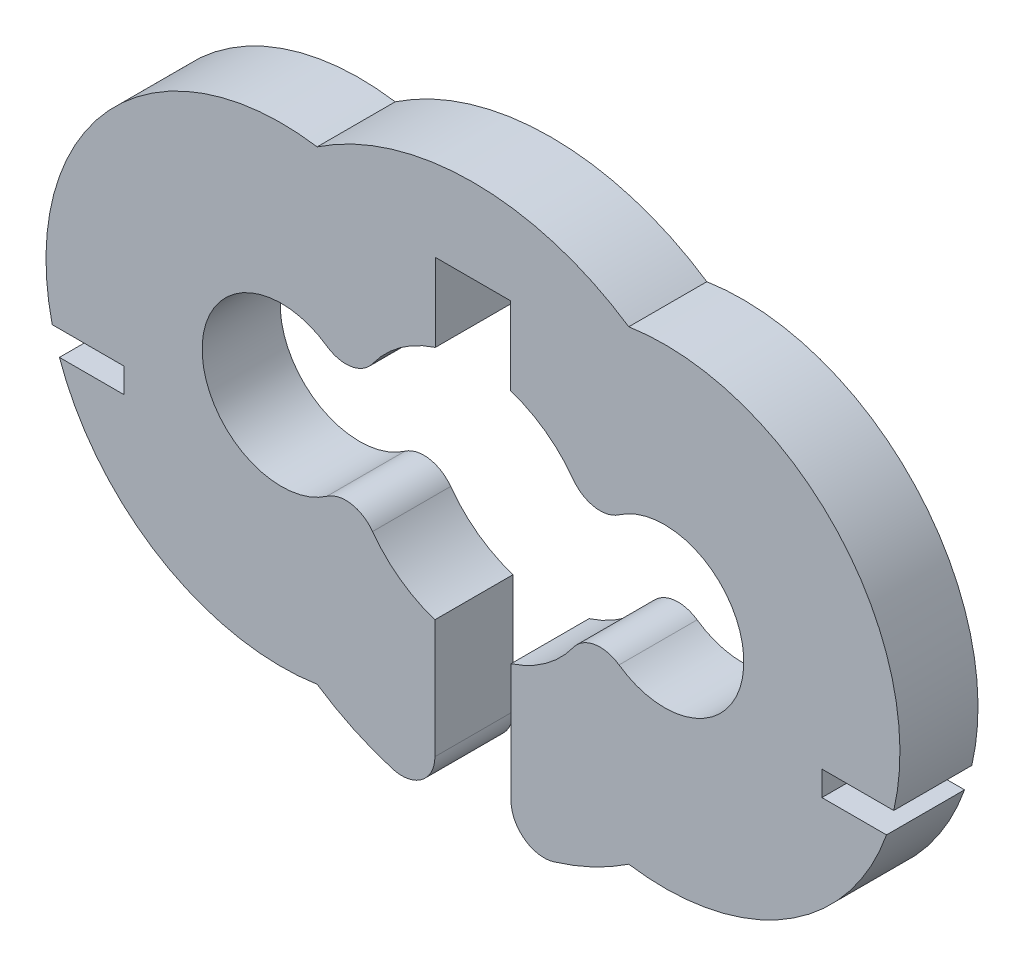
ISO-10303-21;
HEADER;
FILE_DESCRIPTION(('STEP AP214'),'2;1');
FILE_NAME('part.step','',(''),(''),'','','');
FILE_SCHEMA(('AUTOMOTIVE_DESIGN { 1 0 10303 214 1 1 1 1 }'));
ENDSEC;
DATA;
#1=APPLICATION_CONTEXT('core data for automotive mechanical design processes');
#2=APPLICATION_PROTOCOL_DEFINITION('international standard','automotive_design',2000,#1);
#3=PRODUCT_CONTEXT('',#1,'mechanical');
#4=PRODUCT('Part','Part','',(#3));
#5=PRODUCT_RELATED_PRODUCT_CATEGORY('part','',(#4));
#6=PRODUCT_DEFINITION_FORMATION('','',#4);
#7=PRODUCT_DEFINITION_CONTEXT('part definition',#1,'design');
#8=PRODUCT_DEFINITION('design','',#6,#7);
#9=PRODUCT_DEFINITION_SHAPE('','',#8);
#10=(LENGTH_UNIT() NAMED_UNIT(*) SI_UNIT(.MILLI.,.METRE.));
#11=(NAMED_UNIT(*) PLANE_ANGLE_UNIT() SI_UNIT($,.RADIAN.));
#12=(NAMED_UNIT(*) SI_UNIT($,.STERADIAN.) SOLID_ANGLE_UNIT());
#13=UNCERTAINTY_MEASURE_WITH_UNIT(LENGTH_MEASURE(1.E-05),#10,'distance_accuracy_value','');
#14=(GEOMETRIC_REPRESENTATION_CONTEXT(3) GLOBAL_UNCERTAINTY_ASSIGNED_CONTEXT((#13)) GLOBAL_UNIT_ASSIGNED_CONTEXT((#10,
#11,#12)) REPRESENTATION_CONTEXT('',''));
#15=CARTESIAN_POINT('',(0.,0.,0.));
#16=DIRECTION('',(0.,0.,1.));
#17=DIRECTION('',(1.,0.,0.));
#18=AXIS2_PLACEMENT_3D('',#15,#16,#17);
#19=CARTESIAN_POINT('',(7.36085713071678,0.,3.));
#20=DIRECTION('',(0.,0.,-1.));
#21=DIRECTION('',(-1.,0.,0.));
#22=AXIS2_PLACEMENT_3D('',#19,#20,#21);
#23=CYLINDRICAL_SURFACE('',#22,9.048);
#24=CARTESIAN_POINT('',(7.36085713071678,0.,0.));
#25=DIRECTION('',(0.,0.,1.));
#26=DIRECTION('',(-1.,0.,0.));
#27=AXIS2_PLACEMENT_3D('',#24,#25,#26);
#28=CIRCLE('',#27,9.048);
#29=CARTESIAN_POINT('',(5.98757171776819,-8.94317567615568,0.));
#30=VERTEX_POINT('',#29);
#31=CARTESIAN_POINT('',(15.891746826405,-3.015,0.));
#32=VERTEX_POINT('',#31);
#33=EDGE_CURVE('E348',#30,#32,#28,.T.);
#34=ORIENTED_EDGE('',*,*,#33,.T.);
#35=DIRECTION('',(0.,0.,-1.));
#36=VECTOR('',#35,1.);
#37=CARTESIAN_POINT('',(15.891746826405,-3.015,3.));
#38=LINE('',#37,#36);
#39=CARTESIAN_POINT('',(15.891746826405,-3.015,3.));
#40=VERTEX_POINT('',#39);
#41=EDGE_CURVE('E287',#32,#40,#38,.F.);
#42=ORIENTED_EDGE('',*,*,#41,.T.);
#43=CARTESIAN_POINT('',(7.36085713071678,0.,3.));
#44=DIRECTION('',(0.,0.,1.));
#45=DIRECTION('',(-1.,0.,0.));
#46=AXIS2_PLACEMENT_3D('',#43,#44,#45);
#47=CIRCLE('',#46,9.048);
#48=CARTESIAN_POINT('',(5.98757171776819,-8.94317567615568,3.));
#49=VERTEX_POINT('',#48);
#50=EDGE_CURVE('E311',#49,#40,#47,.T.);
#51=ORIENTED_EDGE('',*,*,#50,.F.);
#52=DIRECTION('',(0.,0.,-1.));
#53=VECTOR('',#52,1.);
#54=CARTESIAN_POINT('',(5.98757171776819,-8.94317567615568,3.));
#55=LINE('',#54,#53);
#56=EDGE_CURVE('E398',#49,#30,#55,.T.);
#57=ORIENTED_EDGE('',*,*,#56,.T.);
#58=EDGE_LOOP('',(#34,#42,#51,#57));
#59=FACE_BOUND('',#58,.T.);
#60=ADVANCED_FACE('F39',(#59),#23,.T.);
#61=CARTESIAN_POINT('',(-7.36085713071678,0.,3.));
#62=DIRECTION('',(0.,0.,-1.));
#63=DIRECTION('',(-1.,0.,0.));
#64=AXIS2_PLACEMENT_3D('',#61,#62,#63);
#65=CYLINDRICAL_SURFACE('',#64,9.048);
#66=CARTESIAN_POINT('',(-7.36085713071678,0.,3.));
#67=DIRECTION('',(0.,0.,1.));
#68=DIRECTION('',(1.,0.,0.));
#69=AXIS2_PLACEMENT_3D('',#66,#67,#68);
#70=CIRCLE('',#69,9.048);
#71=CARTESIAN_POINT('',(-15.891746826405,-3.015,3.));
#72=VERTEX_POINT('',#71);
#73=CARTESIAN_POINT('',(-5.98757171776818,-8.94317567615568,3.));
#74=VERTEX_POINT('',#73);
#75=EDGE_CURVE('E317',#72,#74,#70,.T.);
#76=ORIENTED_EDGE('',*,*,#75,.F.);
#77=DIRECTION('',(0.,0.,-1.));
#78=VECTOR('',#77,1.);
#79=CARTESIAN_POINT('',(-15.891746826405,-3.015,3.));
#80=LINE('',#79,#78);
#81=CARTESIAN_POINT('',(-15.891746826405,-3.015,0.));
#82=VERTEX_POINT('',#81);
#83=EDGE_CURVE('E291',#72,#82,#80,.T.);
#84=ORIENTED_EDGE('',*,*,#83,.T.);
#85=CARTESIAN_POINT('',(-7.36085713071678,0.,0.));
#86=DIRECTION('',(0.,0.,1.));
#87=DIRECTION('',(1.,0.,0.));
#88=AXIS2_PLACEMENT_3D('',#85,#86,#87);
#89=CIRCLE('',#88,9.048);
#90=CARTESIAN_POINT('',(-5.98757171776818,-8.94317567615568,0.));
#91=VERTEX_POINT('',#90);
#92=EDGE_CURVE('E353',#82,#91,#89,.T.);
#93=ORIENTED_EDGE('',*,*,#92,.T.);
#94=DIRECTION('',(0.,0.,-1.));
#95=VECTOR('',#94,1.);
#96=CARTESIAN_POINT('',(-5.98757171776818,-8.94317567615568,3.));
#97=LINE('',#96,#95);
#98=EDGE_CURVE('E388',#74,#91,#97,.T.);
#99=ORIENTED_EDGE('',*,*,#98,.F.);
#100=EDGE_LOOP('',(#76,#84,#93,#99));
#101=FACE_BOUND('',#100,.T.);
#102=ADVANCED_FACE('F523',(#101),#65,.T.);
#103=CARTESIAN_POINT('',(0.,0.,3.));
#104=DIRECTION('',(0.,0.,-1.));
#105=DIRECTION('',(-1.,0.,0.));
#106=AXIS2_PLACEMENT_3D('',#103,#104,#105);
#107=CYLINDRICAL_SURFACE('',#106,4.7625);
#108=CARTESIAN_POINT('',(0.,0.,0.));
#109=DIRECTION('',(0.,0.,-1.));
#110=DIRECTION('',(1.,0.,0.));
#111=AXIS2_PLACEMENT_3D('',#108,#109,#110);
#112=CIRCLE('',#111,4.7625);
#113=CARTESIAN_POINT('',(1.4475,4.53719627082629,0.));
#114=VERTEX_POINT('',#113);
#115=CARTESIAN_POINT('',(3.85725334224875,2.79338556302402,0.));
#116=VERTEX_POINT('',#115);
#117=EDGE_CURVE('E298',#114,#116,#112,.T.);
#118=ORIENTED_EDGE('',*,*,#117,.T.);
#119=DIRECTION('',(0.,0.,-1.));
#120=VECTOR('',#119,1.);
#121=CARTESIAN_POINT('',(3.85725334224875,2.79338556302402,3.));
#122=LINE('',#121,#120);
#123=CARTESIAN_POINT('',(3.85725334224875,2.79338556302402,3.));
#124=VERTEX_POINT('',#123);
#125=EDGE_CURVE('E11',#116,#124,#122,.F.);
#126=ORIENTED_EDGE('',*,*,#125,.T.);
#127=CARTESIAN_POINT('',(0.,0.,3.));
#128=DIRECTION('',(0.,0.,-1.));
#129=DIRECTION('',(1.,0.,0.));
#130=AXIS2_PLACEMENT_3D('',#127,#128,#129);
#131=CIRCLE('',#130,4.7625);
#132=CARTESIAN_POINT('',(1.4475,4.53719627082629,3.));
#133=VERTEX_POINT('',#132);
#134=EDGE_CURVE('E300',#133,#124,#131,.T.);
#135=ORIENTED_EDGE('',*,*,#134,.F.);
#136=DIRECTION('',(0.,0.,-1.));
#137=VECTOR('',#136,1.);
#138=CARTESIAN_POINT('',(1.4475,4.53719627082629,3.));
#139=LINE('',#138,#137);
#140=EDGE_CURVE('E337',#133,#114,#139,.T.);
#141=ORIENTED_EDGE('',*,*,#140,.T.);
#142=EDGE_LOOP('',(#118,#126,#135,#141));
#143=FACE_BOUND('',#142,.T.);
#144=ADVANCED_FACE('F535',(#143),#107,.F.);
#145=CARTESIAN_POINT('',(7.36085713071678,0.,3.));
#146=DIRECTION('',(0.,0.,-1.));
#147=DIRECTION('',(-1.,0.,0.));
#148=AXIS2_PLACEMENT_3D('',#145,#146,#147);
#149=CYLINDRICAL_SURFACE('',#148,3.048);
#150=CARTESIAN_POINT('',(7.36085713071678,0.,0.));
#151=DIRECTION('',(0.,0.,-1.));
#152=DIRECTION('',(-1.,0.,0.));
#153=AXIS2_PLACEMENT_3D('',#150,#151,#152);
#154=CIRCLE('',#153,3.048);
#155=CARTESIAN_POINT('',(5.6137962621038,2.49761532693913,0.));
#156=VERTEX_POINT('',#155);
#157=CARTESIAN_POINT('',(5.6137962621038,-2.49761532693913,0.));
#158=VERTEX_POINT('',#157);
#159=EDGE_CURVE('E339',#156,#158,#154,.T.);
#160=ORIENTED_EDGE('',*,*,#159,.T.);
#161=DIRECTION('',(0.,0.,-1.));
#162=VECTOR('',#161,1.);
#163=CARTESIAN_POINT('',(5.6137962621038,-2.49761532693913,3.));
#164=LINE('',#163,#162);
#165=CARTESIAN_POINT('',(5.6137962621038,-2.49761532693913,3.));
#166=VERTEX_POINT('',#165);
#167=EDGE_CURVE('E450',#158,#166,#164,.F.);
#168=ORIENTED_EDGE('',*,*,#167,.T.);
#169=CARTESIAN_POINT('',(7.36085713071678,0.,3.));
#170=DIRECTION('',(0.,0.,-1.));
#171=DIRECTION('',(-1.,0.,0.));
#172=AXIS2_PLACEMENT_3D('',#169,#170,#171);
#173=CIRCLE('',#172,3.048);
#174=CARTESIAN_POINT('',(5.6137962621038,2.49761532693913,3.));
#175=VERTEX_POINT('',#174);
#176=EDGE_CURVE('E297',#175,#166,#173,.T.);
#177=ORIENTED_EDGE('',*,*,#176,.F.);
#178=DIRECTION('',(0.,0.,-1.));
#179=VECTOR('',#178,1.);
#180=CARTESIAN_POINT('',(5.6137962621038,2.49761532693914,3.));
#181=LINE('',#180,#179);
#182=EDGE_CURVE('E443',#175,#156,#181,.T.);
#183=ORIENTED_EDGE('',*,*,#182,.T.);
#184=EDGE_LOOP('',(#160,#168,#177,#183));
#185=FACE_BOUND('',#184,.T.);
#186=ADVANCED_FACE('F700',(#185),#149,.F.);
#187=CARTESIAN_POINT('',(0.,0.,3.));
#188=DIRECTION('',(0.,0.,-1.));
#189=DIRECTION('',(-1.,0.,0.));
#190=AXIS2_PLACEMENT_3D('',#187,#188,#189);
#191=CYLINDRICAL_SURFACE('',#190,4.7625);
#192=CARTESIAN_POINT('',(0.,0.,3.));
#193=DIRECTION('',(0.,0.,-1.));
#194=DIRECTION('',(-1.,0.,0.));
#195=AXIS2_PLACEMENT_3D('',#192,#193,#194);
#196=CIRCLE('',#195,4.7625);
#197=CARTESIAN_POINT('',(3.85725334224873,-2.79338556302402,3.));
#198=VERTEX_POINT('',#197);
#199=CARTESIAN_POINT('',(1.4625,-4.53238347892144,3.));
#200=VERTEX_POINT('',#199);
#201=EDGE_CURVE('E302',#198,#200,#196,.T.);
#202=ORIENTED_EDGE('',*,*,#201,.F.);
#203=DIRECTION('',(0.,0.,-1.));
#204=VECTOR('',#203,1.);
#205=CARTESIAN_POINT('',(3.85725334224873,-2.79338556302402,3.));
#206=LINE('',#205,#204);
#207=CARTESIAN_POINT('',(3.85725334224873,-2.79338556302402,0.));
#208=VERTEX_POINT('',#207);
#209=EDGE_CURVE('E441',#198,#208,#206,.T.);
#210=ORIENTED_EDGE('',*,*,#209,.T.);
#211=CARTESIAN_POINT('',(0.,0.,0.));
#212=DIRECTION('',(0.,0.,-1.));
#213=DIRECTION('',(-1.,0.,0.));
#214=AXIS2_PLACEMENT_3D('',#211,#212,#213);
#215=CIRCLE('',#214,4.7625);
#216=CARTESIAN_POINT('',(1.4625,-4.53238347892144,0.));
#217=VERTEX_POINT('',#216);
#218=EDGE_CURVE('E345',#208,#217,#215,.T.);
#219=ORIENTED_EDGE('',*,*,#218,.T.);
#220=DIRECTION('',(0.,0.,-1.));
#221=VECTOR('',#220,1.);
#222=CARTESIAN_POINT('',(1.4625,-4.53238347892144,3.));
#223=LINE('',#222,#221);
#224=EDGE_CURVE('E405',#200,#217,#223,.T.);
#225=ORIENTED_EDGE('',*,*,#224,.F.);
#226=EDGE_LOOP('',(#202,#210,#219,#225));
#227=FACE_BOUND('',#226,.T.);
#228=ADVANCED_FACE('F703',(#227),#191,.F.);
#229=CARTESIAN_POINT('',(1.4625,-10.6626685215287,3.));
#230=DIRECTION('',(1.,0.,0.));
#231=DIRECTION('',(0.,1.,0.));
#232=AXIS2_PLACEMENT_3D('',#229,#230,#231);
#233=PLANE('',#232);
#234=DIRECTION('',(0.,-1.,0.));
#235=VECTOR('',#234,1.);
#236=CARTESIAN_POINT('',(1.4625,-10.6626685215287,0.));
#237=LINE('',#236,#235);
#238=CARTESIAN_POINT('',(1.4625,-9.09070954326448,0.));
#239=VERTEX_POINT('',#238);
#240=EDGE_CURVE('E341',#217,#239,#237,.T.);
#241=ORIENTED_EDGE('',*,*,#240,.T.);
#242=DIRECTION('',(0.,0.,-1.));
#243=VECTOR('',#242,1.);
#244=CARTESIAN_POINT('',(1.4625,-9.09070954326448,3.));
#245=LINE('',#244,#243);
#246=CARTESIAN_POINT('',(1.4625,-9.09070954326448,3.));
#247=VERTEX_POINT('',#246);
#248=EDGE_CURVE('E65',#239,#247,#245,.F.);
#249=ORIENTED_EDGE('',*,*,#248,.T.);
#250=DIRECTION('',(0.,-1.,0.));
#251=VECTOR('',#250,1.);
#252=CARTESIAN_POINT('',(1.4625,-10.6626685215287,3.));
#253=LINE('',#252,#251);
#254=EDGE_CURVE('E306',#200,#247,#253,.T.);
#255=ORIENTED_EDGE('',*,*,#254,.F.);
#256=ORIENTED_EDGE('',*,*,#224,.T.);
#257=EDGE_LOOP('',(#241,#249,#255,#256));
#258=FACE_BOUND('',#257,.T.);
#259=ADVANCED_FACE('F549',(#258),#233,.F.);
#260=CARTESIAN_POINT('',(0.,0.,3.));
#261=DIRECTION('',(0.,0.,-1.));
#262=DIRECTION('',(-1.,0.,0.));
#263=AXIS2_PLACEMENT_3D('',#260,#261,#262);
#264=CYLINDRICAL_SURFACE('',#263,10.7625000000001);
#265=CARTESIAN_POINT('',(0.,0.,3.));
#266=DIRECTION('',(0.,0.,1.));
#267=DIRECTION('',(-1.,0.,0.));
#268=AXIS2_PLACEMENT_3D('',#265,#266,#267);
#269=CIRCLE('',#268,10.7625000000001);
#270=CARTESIAN_POINT('',(3.09808072162233,-10.3069540647231,3.));
#271=VERTEX_POINT('',#270);
#272=EDGE_CURVE('E308',#271,#49,#269,.T.);
#273=ORIENTED_EDGE('',*,*,#272,.F.);
#274=DIRECTION('',(0.,0.,-1.));
#275=VECTOR('',#274,1.);
#276=CARTESIAN_POINT('',(3.09808072162233,-10.3069540647231,3.));
#277=LINE('',#276,#275);
#278=CARTESIAN_POINT('',(3.09808072162233,-10.3069540647231,0.));
#279=VERTEX_POINT('',#278);
#280=EDGE_CURVE('E440',#271,#279,#277,.T.);
#281=ORIENTED_EDGE('',*,*,#280,.T.);
#282=CARTESIAN_POINT('',(0.,0.,0.));
#283=DIRECTION('',(0.,0.,1.));
#284=DIRECTION('',(-1.,0.,0.));
#285=AXIS2_PLACEMENT_3D('',#282,#283,#284);
#286=CIRCLE('',#285,10.7625000000001);
#287=EDGE_CURVE('E346',#279,#30,#286,.T.);
#288=ORIENTED_EDGE('',*,*,#287,.T.);
#289=ORIENTED_EDGE('',*,*,#56,.F.);
#290=EDGE_LOOP('',(#273,#281,#288,#289));
#291=FACE_BOUND('',#290,.T.);
#292=ADVANCED_FACE('F538',(#291),#264,.T.);
#293=CARTESIAN_POINT('',(16.1700613513033,-2.065,3.));
#294=VERTEX_POINT('',#293);
#295=CARTESIAN_POINT('',(5.98757171776818,8.94317567615568,3.));
#296=VERTEX_POINT('',#295);
#297=EDGE_CURVE('E309',#294,#296,#47,.T.);
#298=ORIENTED_EDGE('',*,*,#297,.F.);
#299=DIRECTION('',(0.,0.,-1.));
#300=VECTOR('',#299,1.);
#301=CARTESIAN_POINT('',(16.1700613513033,-2.065,3.));
#302=LINE('',#301,#300);
#303=CARTESIAN_POINT('',(16.1700613513033,-2.065,0.));
#304=VERTEX_POINT('',#303);
#305=EDGE_CURVE('E283',#294,#304,#302,.T.);
#306=ORIENTED_EDGE('',*,*,#305,.T.);
#307=CARTESIAN_POINT('',(5.98757171776818,8.94317567615568,0.));
#308=VERTEX_POINT('',#307);
#309=EDGE_CURVE('E347',#304,#308,#28,.T.);
#310=ORIENTED_EDGE('',*,*,#309,.T.);
#311=DIRECTION('',(0.,0.,-1.));
#312=VECTOR('',#311,1.);
#313=CARTESIAN_POINT('',(5.98757171776818,8.94317567615568,3.));
#314=LINE('',#313,#312);
#315=EDGE_CURVE('E396',#296,#308,#314,.T.);
#316=ORIENTED_EDGE('',*,*,#315,.F.);
#317=EDGE_LOOP('',(#298,#306,#310,#316));
#318=FACE_BOUND('',#317,.T.);
#319=ADVANCED_FACE('F527',(#318),#23,.T.);
#320=CARTESIAN_POINT('',(0.,-1.05818132034585E-13,3.));
#321=DIRECTION('',(0.,0.,-1.));
#322=DIRECTION('',(-1.,0.,0.));
#323=AXIS2_PLACEMENT_3D('',#320,#321,#322);
#324=CYLINDRICAL_SURFACE('',#323,10.7625000000001);
#325=CARTESIAN_POINT('',(0.,-1.05818132034585E-13,0.));
#326=DIRECTION('',(0.,0.,1.));
#327=DIRECTION('',(-1.,0.,0.));
#328=AXIS2_PLACEMENT_3D('',#325,#326,#327);
#329=CIRCLE('',#328,10.7625000000001);
#330=CARTESIAN_POINT('',(-5.98757171776818,8.94317567615568,0.));
#331=VERTEX_POINT('',#330);
#332=EDGE_CURVE('E352',#308,#331,#329,.T.);
#333=ORIENTED_EDGE('',*,*,#332,.T.);
#334=DIRECTION('',(0.,0.,-1.));
#335=VECTOR('',#334,1.);
#336=CARTESIAN_POINT('',(-5.98757171776818,8.94317567615568,3.));
#337=LINE('',#336,#335);
#338=CARTESIAN_POINT('',(-5.98757171776818,8.94317567615568,3.));
#339=VERTEX_POINT('',#338);
#340=EDGE_CURVE('E392',#339,#331,#337,.T.);
#341=ORIENTED_EDGE('',*,*,#340,.F.);
#342=CARTESIAN_POINT('',(0.,-1.05818132034585E-13,3.));
#343=DIRECTION('',(0.,0.,1.));
#344=DIRECTION('',(-1.,0.,0.));
#345=AXIS2_PLACEMENT_3D('',#342,#343,#344);
#346=CIRCLE('',#345,10.7625000000001);
#347=EDGE_CURVE('E313',#296,#339,#346,.T.);
#348=ORIENTED_EDGE('',*,*,#347,.F.);
#349=ORIENTED_EDGE('',*,*,#315,.T.);
#350=EDGE_LOOP('',(#333,#341,#348,#349));
#351=FACE_BOUND('',#350,.T.);
#352=ADVANCED_FACE('F536',(#351),#324,.T.);
#353=CARTESIAN_POINT('',(-16.1700613513033,-2.065,0.));
#354=VERTEX_POINT('',#353);
#355=EDGE_CURVE('E355',#331,#354,#89,.T.);
#356=ORIENTED_EDGE('',*,*,#355,.T.);
#357=DIRECTION('',(0.,0.,-1.));
#358=VECTOR('',#357,1.);
#359=CARTESIAN_POINT('',(-16.1700613513033,-2.065,3.));
#360=LINE('',#359,#358);
#361=CARTESIAN_POINT('',(-16.1700613513033,-2.065,3.));
#362=VERTEX_POINT('',#361);
#363=EDGE_CURVE('E293',#354,#362,#360,.F.);
#364=ORIENTED_EDGE('',*,*,#363,.T.);
#365=EDGE_CURVE('E261',#339,#362,#70,.T.);
#366=ORIENTED_EDGE('',*,*,#365,.F.);
#367=ORIENTED_EDGE('',*,*,#340,.T.);
#368=EDGE_LOOP('',(#356,#364,#366,#367));
#369=FACE_BOUND('',#368,.T.);
#370=ADVANCED_FACE('F533',(#369),#65,.T.);
#371=CARTESIAN_POINT('',(0.,0.,3.));
#372=DIRECTION('',(0.,0.,-1.));
#373=DIRECTION('',(-1.,0.,0.));
#374=AXIS2_PLACEMENT_3D('',#371,#372,#373);
#375=CYLINDRICAL_SURFACE('',#374,10.7625000000001);
#376=CARTESIAN_POINT('',(0.,0.,0.));
#377=DIRECTION('',(0.,0.,1.));
#378=DIRECTION('',(1.,0.,0.));
#379=AXIS2_PLACEMENT_3D('',#376,#377,#378);
#380=CIRCLE('',#379,10.7625000000001);
#381=CARTESIAN_POINT('',(-3.09808072162233,-10.3069540647231,0.));
#382=VERTEX_POINT('',#381);
#383=EDGE_CURVE('E356',#91,#382,#380,.T.);
#384=ORIENTED_EDGE('',*,*,#383,.T.);
#385=DIRECTION('',(0.,0.,-1.));
#386=VECTOR('',#385,1.);
#387=CARTESIAN_POINT('',(-3.09808072162233,-10.3069540647231,3.));
#388=LINE('',#387,#386);
#389=CARTESIAN_POINT('',(-3.09808072162233,-10.3069540647231,3.));
#390=VERTEX_POINT('',#389);
#391=EDGE_CURVE('E425',#382,#390,#388,.F.);
#392=ORIENTED_EDGE('',*,*,#391,.T.);
#393=CARTESIAN_POINT('',(0.,0.,3.));
#394=DIRECTION('',(0.,0.,1.));
#395=DIRECTION('',(1.,0.,0.));
#396=AXIS2_PLACEMENT_3D('',#393,#394,#395);
#397=CIRCLE('',#396,10.7625000000001);
#398=EDGE_CURVE('E319',#74,#390,#397,.T.);
#399=ORIENTED_EDGE('',*,*,#398,.F.);
#400=ORIENTED_EDGE('',*,*,#98,.T.);
#401=EDGE_LOOP('',(#384,#392,#399,#400));
#402=FACE_BOUND('',#401,.T.);
#403=ADVANCED_FACE('F506',(#402),#375,.T.);
#404=CARTESIAN_POINT('',(-1.4625,-10.6626685215287,3.));
#405=DIRECTION('',(-1.,0.,0.));
#406=DIRECTION('',(0.,0.,1.));
#407=AXIS2_PLACEMENT_3D('',#404,#405,#406);
#408=PLANE('',#407);
#409=DIRECTION('',(0.,1.,0.));
#410=VECTOR('',#409,1.);
#411=CARTESIAN_POINT('',(-1.4625,-10.6626685215287,3.));
#412=LINE('',#411,#410);
#413=CARTESIAN_POINT('',(-1.4625,-9.09070954326449,3.));
#414=VERTEX_POINT('',#413);
#415=CARTESIAN_POINT('',(-1.4625,-4.53238347892144,3.));
#416=VERTEX_POINT('',#415);
#417=EDGE_CURVE('E318',#414,#416,#412,.T.);
#418=ORIENTED_EDGE('',*,*,#417,.F.);
#419=DIRECTION('',(0.,0.,-1.));
#420=VECTOR('',#419,1.);
#421=CARTESIAN_POINT('',(-1.4625,-9.09070954326449,3.));
#422=LINE('',#421,#420);
#423=CARTESIAN_POINT('',(-1.4625,-9.09070954326449,0.));
#424=VERTEX_POINT('',#423);
#425=EDGE_CURVE('E406',#414,#424,#422,.T.);
#426=ORIENTED_EDGE('',*,*,#425,.T.);
#427=DIRECTION('',(0.,1.,0.));
#428=VECTOR('',#427,1.);
#429=CARTESIAN_POINT('',(-1.4625,-10.6626685215287,0.));
#430=LINE('',#429,#428);
#431=CARTESIAN_POINT('',(-1.4625,-4.53238347892144,0.));
#432=VERTEX_POINT('',#431);
#433=EDGE_CURVE('E363',#424,#432,#430,.T.);
#434=ORIENTED_EDGE('',*,*,#433,.T.);
#435=DIRECTION('',(0.,0.,-1.));
#436=VECTOR('',#435,1.);
#437=CARTESIAN_POINT('',(-1.4625,-4.53238347892144,3.));
#438=LINE('',#437,#436);
#439=EDGE_CURVE('E390',#416,#432,#438,.T.);
#440=ORIENTED_EDGE('',*,*,#439,.F.);
#441=EDGE_LOOP('',(#418,#426,#434,#440));
#442=FACE_BOUND('',#441,.T.);
#443=ADVANCED_FACE('F499',(#442),#408,.F.);
#444=CARTESIAN_POINT('',(0.,0.,3.));
#445=DIRECTION('',(0.,0.,-1.));
#446=DIRECTION('',(-1.,0.,0.));
#447=AXIS2_PLACEMENT_3D('',#444,#445,#446);
#448=CYLINDRICAL_SURFACE('',#447,4.7625);
#449=CARTESIAN_POINT('',(0.,0.,0.));
#450=DIRECTION('',(0.,0.,-1.));
#451=DIRECTION('',(1.,0.,0.));
#452=AXIS2_PLACEMENT_3D('',#449,#450,#451);
#453=CIRCLE('',#452,4.7625);
#454=CARTESIAN_POINT('',(-3.85725334224872,-2.79338556302402,0.));
#455=VERTEX_POINT('',#454);
#456=EDGE_CURVE('E361',#432,#455,#453,.T.);
#457=ORIENTED_EDGE('',*,*,#456,.T.);
#458=DIRECTION('',(0.,0.,-1.));
#459=VECTOR('',#458,1.);
#460=CARTESIAN_POINT('',(-3.85725334224872,-2.79338556302402,3.));
#461=LINE('',#460,#459);
#462=CARTESIAN_POINT('',(-3.85725334224872,-2.79338556302402,3.));
#463=VERTEX_POINT('',#462);
#464=EDGE_CURVE('E451',#455,#463,#461,.F.);
#465=ORIENTED_EDGE('',*,*,#464,.T.);
#466=CARTESIAN_POINT('',(0.,0.,3.));
#467=DIRECTION('',(0.,0.,-1.));
#468=DIRECTION('',(1.,0.,0.));
#469=AXIS2_PLACEMENT_3D('',#466,#467,#468);
#470=CIRCLE('',#469,4.7625);
#471=EDGE_CURVE('E325',#416,#463,#470,.T.);
#472=ORIENTED_EDGE('',*,*,#471,.F.);
#473=ORIENTED_EDGE('',*,*,#439,.T.);
#474=EDGE_LOOP('',(#457,#465,#472,#473));
#475=FACE_BOUND('',#474,.T.);
#476=ADVANCED_FACE('F493',(#475),#448,.F.);
#477=CARTESIAN_POINT('',(-7.36085713071678,0.,3.));
#478=DIRECTION('',(0.,0.,-1.));
#479=DIRECTION('',(-1.,0.,0.));
#480=AXIS2_PLACEMENT_3D('',#477,#478,#479);
#481=CYLINDRICAL_SURFACE('',#480,3.048);
#482=CARTESIAN_POINT('',(-7.36085713071678,0.,3.));
#483=DIRECTION('',(0.,0.,-1.));
#484=DIRECTION('',(1.,0.,0.));
#485=AXIS2_PLACEMENT_3D('',#482,#483,#484);
#486=CIRCLE('',#485,3.048);
#487=CARTESIAN_POINT('',(-5.61379626210379,-2.49761532693913,3.));
#488=VERTEX_POINT('',#487);
#489=CARTESIAN_POINT('',(-5.61379626210379,2.49761532693912,3.));
#490=VERTEX_POINT('',#489);
#491=EDGE_CURVE('E323',#488,#490,#486,.T.);
#492=ORIENTED_EDGE('',*,*,#491,.F.);
#493=DIRECTION('',(0.,0.,-1.));
#494=VECTOR('',#493,1.);
#495=CARTESIAN_POINT('',(-5.61379626210379,-2.49761532693913,3.));
#496=LINE('',#495,#494);
#497=CARTESIAN_POINT('',(-5.61379626210379,-2.49761532693913,0.));
#498=VERTEX_POINT('',#497);
#499=EDGE_CURVE('E452',#488,#498,#496,.T.);
#500=ORIENTED_EDGE('',*,*,#499,.T.);
#501=CARTESIAN_POINT('',(-7.36085713071678,0.,0.));
#502=DIRECTION('',(0.,0.,-1.));
#503=DIRECTION('',(1.,0.,0.));
#504=AXIS2_PLACEMENT_3D('',#501,#502,#503);
#505=CIRCLE('',#504,3.048);
#506=CARTESIAN_POINT('',(-5.61379626210379,2.49761532693912,0.));
#507=VERTEX_POINT('',#506);
#508=EDGE_CURVE('E366',#498,#507,#505,.T.);
#509=ORIENTED_EDGE('',*,*,#508,.T.);
#510=DIRECTION('',(0.,0.,-1.));
#511=VECTOR('',#510,1.);
#512=CARTESIAN_POINT('',(-5.61379626210379,2.49761532693912,3.));
#513=LINE('',#512,#511);
#514=EDGE_CURVE('E446',#507,#490,#513,.F.);
#515=ORIENTED_EDGE('',*,*,#514,.T.);
#516=EDGE_LOOP('',(#492,#500,#509,#515));
#517=FACE_BOUND('',#516,.T.);
#518=ADVANCED_FACE('F485',(#517),#481,.F.);
#519=CARTESIAN_POINT('',(0.,0.,3.));
#520=DIRECTION('',(0.,0.,-1.));
#521=DIRECTION('',(-1.,0.,0.));
#522=AXIS2_PLACEMENT_3D('',#519,#520,#521);
#523=CYLINDRICAL_SURFACE('',#522,4.76250000000008);
#524=CARTESIAN_POINT('',(0.,0.,3.));
#525=DIRECTION('',(0.,0.,-1.));
#526=DIRECTION('',(-1.,0.,0.));
#527=AXIS2_PLACEMENT_3D('',#524,#525,#526);
#528=CIRCLE('',#527,4.76250000000008);
#529=CARTESIAN_POINT('',(-3.85725334224872,2.79338556302402,3.));
#530=VERTEX_POINT('',#529);
#531=CARTESIAN_POINT('',(-1.4475,4.53719627082629,3.));
#532=VERTEX_POINT('',#531);
#533=EDGE_CURVE('E327',#530,#532,#528,.T.);
#534=ORIENTED_EDGE('',*,*,#533,.F.);
#535=DIRECTION('',(0.,0.,-1.));
#536=VECTOR('',#535,1.);
#537=CARTESIAN_POINT('',(-3.85725334224872,2.79338556302402,3.));
#538=LINE('',#537,#536);
#539=CARTESIAN_POINT('',(-3.85725334224872,2.79338556302402,0.));
#540=VERTEX_POINT('',#539);
#541=EDGE_CURVE('E50',#530,#540,#538,.T.);
#542=ORIENTED_EDGE('',*,*,#541,.T.);
#543=CARTESIAN_POINT('',(0.,0.,0.));
#544=DIRECTION('',(0.,0.,-1.));
#545=DIRECTION('',(-1.,0.,0.));
#546=AXIS2_PLACEMENT_3D('',#543,#544,#545);
#547=CIRCLE('',#546,4.76250000000008);
#548=CARTESIAN_POINT('',(-1.4475,4.53719627082629,0.));
#549=VERTEX_POINT('',#548);
#550=EDGE_CURVE('E367',#540,#549,#547,.T.);
#551=ORIENTED_EDGE('',*,*,#550,.T.);
#552=DIRECTION('',(0.,0.,-1.));
#553=VECTOR('',#552,1.);
#554=CARTESIAN_POINT('',(-1.4475,4.53719627082629,3.));
#555=LINE('',#554,#553);
#556=EDGE_CURVE('E381',#532,#549,#555,.T.);
#557=ORIENTED_EDGE('',*,*,#556,.F.);
#558=EDGE_LOOP('',(#534,#542,#551,#557));
#559=FACE_BOUND('',#558,.T.);
#560=ADVANCED_FACE('F459',(#559),#523,.F.);
#561=CARTESIAN_POINT('',(-1.4475,7.53719627082629,3.));
#562=DIRECTION('',(-1.,0.,0.));
#563=DIRECTION('',(0.,-1.,0.));
#564=AXIS2_PLACEMENT_3D('',#561,#562,#563);
#565=PLANE('',#564);
#566=DIRECTION('',(0.,1.,0.));
#567=VECTOR('',#566,1.);
#568=CARTESIAN_POINT('',(-1.4475,7.53719627082629,0.));
#569=LINE('',#568,#567);
#570=CARTESIAN_POINT('',(-1.4475,7.53719627082629,0.));
#571=VERTEX_POINT('',#570);
#572=EDGE_CURVE('E371',#549,#571,#569,.T.);
#573=ORIENTED_EDGE('',*,*,#572,.T.);
#574=DIRECTION('',(0.,0.,-1.));
#575=VECTOR('',#574,1.);
#576=CARTESIAN_POINT('',(-1.4475,7.53719627082629,3.));
#577=LINE('',#576,#575);
#578=CARTESIAN_POINT('',(-1.4475,7.53719627082629,3.));
#579=VERTEX_POINT('',#578);
#580=EDGE_CURVE('E382',#579,#571,#577,.T.);
#581=ORIENTED_EDGE('',*,*,#580,.F.);
#582=DIRECTION('',(0.,1.,0.));
#583=VECTOR('',#582,1.);
#584=CARTESIAN_POINT('',(-1.4475,7.53719627082629,3.));
#585=LINE('',#584,#583);
#586=EDGE_CURVE('E329',#532,#579,#585,.T.);
#587=ORIENTED_EDGE('',*,*,#586,.F.);
#588=ORIENTED_EDGE('',*,*,#556,.T.);
#589=EDGE_LOOP('',(#573,#581,#587,#588));
#590=FACE_BOUND('',#589,.T.);
#591=ADVANCED_FACE('F474',(#590),#565,.F.);
#592=CARTESIAN_POINT('',(-1.4475,7.53719627082629,3.));
#593=DIRECTION('',(0.,1.,0.));
#594=DIRECTION('',(-1.,0.,0.));
#595=AXIS2_PLACEMENT_3D('',#592,#593,#594);
#596=PLANE('',#595);
#597=DIRECTION('',(1.,0.,0.));
#598=VECTOR('',#597,1.);
#599=CARTESIAN_POINT('',(-1.4475,7.53719627082629,0.));
#600=LINE('',#599,#598);
#601=CARTESIAN_POINT('',(1.4475,7.53719627082629,0.));
#602=VERTEX_POINT('',#601);
#603=EDGE_CURVE('E373',#571,#602,#600,.T.);
#604=ORIENTED_EDGE('',*,*,#603,.T.);
#605=DIRECTION('',(0.,0.,-1.));
#606=VECTOR('',#605,1.);
#607=CARTESIAN_POINT('',(1.4475,7.53719627082629,3.));
#608=LINE('',#607,#606);
#609=CARTESIAN_POINT('',(1.4475,7.53719627082629,3.));
#610=VERTEX_POINT('',#609);
#611=EDGE_CURVE('E377',#610,#602,#608,.T.);
#612=ORIENTED_EDGE('',*,*,#611,.F.);
#613=DIRECTION('',(1.,0.,0.));
#614=VECTOR('',#613,1.);
#615=CARTESIAN_POINT('',(-1.4475,7.53719627082629,3.));
#616=LINE('',#615,#614);
#617=EDGE_CURVE('E332',#579,#610,#616,.T.);
#618=ORIENTED_EDGE('',*,*,#617,.F.);
#619=ORIENTED_EDGE('',*,*,#580,.T.);
#620=EDGE_LOOP('',(#604,#612,#618,#619));
#621=FACE_BOUND('',#620,.T.);
#622=ADVANCED_FACE('F480',(#621),#596,.F.);
#623=CARTESIAN_POINT('',(1.4475,7.53719627082629,3.));
#624=DIRECTION('',(1.,0.,0.));
#625=DIRECTION('',(0.,1.,0.));
#626=AXIS2_PLACEMENT_3D('',#623,#624,#625);
#627=PLANE('',#626);
#628=DIRECTION('',(0.,-1.,0.));
#629=VECTOR('',#628,1.);
#630=CARTESIAN_POINT('',(1.4475,7.53719627082629,0.));
#631=LINE('',#630,#629);
#632=EDGE_CURVE('E301',#602,#114,#631,.T.);
#633=ORIENTED_EDGE('',*,*,#632,.T.);
#634=ORIENTED_EDGE('',*,*,#140,.F.);
#635=DIRECTION('',(0.,-1.,0.));
#636=VECTOR('',#635,1.);
#637=CARTESIAN_POINT('',(1.4475,7.53719627082629,3.));
#638=LINE('',#637,#636);
#639=EDGE_CURVE('E333',#610,#133,#638,.T.);
#640=ORIENTED_EDGE('',*,*,#639,.F.);
#641=ORIENTED_EDGE('',*,*,#611,.T.);
#642=EDGE_LOOP('',(#633,#634,#640,#641));
#643=FACE_BOUND('',#642,.T.);
#644=ADVANCED_FACE('F589',(#643),#627,.F.);
#645=CARTESIAN_POINT('',(0.,0.,3.));
#646=DIRECTION('',(0.,0.,1.));
#647=DIRECTION('',(1.,0.,0.));
#648=AXIS2_PLACEMENT_3D('',#645,#646,#647);
#649=PLANE('',#648);
#650=ORIENTED_EDGE('',*,*,#398,.T.);
#651=CARTESIAN_POINT('',(-2.7325,-9.09070954326449,3.));
#652=DIRECTION('',(0.,0.,1.));
#653=DIRECTION('',(1.,0.,0.));
#654=AXIS2_PLACEMENT_3D('',#651,#652,#653);
#655=CIRCLE('',#654,1.27);
#656=EDGE_CURVE('E434',#390,#414,#655,.T.);
#657=ORIENTED_EDGE('',*,*,#656,.T.);
#658=ORIENTED_EDGE('',*,*,#417,.T.);
#659=ORIENTED_EDGE('',*,*,#471,.T.);
#660=CARTESIAN_POINT('',(-4.88585423351505,-3.53828837983043,3.));
#661=DIRECTION('',(0.,0.,1.));
#662=DIRECTION('',(1.,0.,0.));
#663=AXIS2_PLACEMENT_3D('',#660,#661,#662);
#664=CIRCLE('',#663,1.27);
#665=EDGE_CURVE('E427',#463,#488,#664,.T.);
#666=ORIENTED_EDGE('',*,*,#665,.T.);
#667=ORIENTED_EDGE('',*,*,#491,.T.);
#668=CARTESIAN_POINT('',(-4.88585423351504,3.53828837983043,3.));
#669=DIRECTION('',(0.,0.,1.));
#670=DIRECTION('',(1.,0.,0.));
#671=AXIS2_PLACEMENT_3D('',#668,#669,#670);
#672=CIRCLE('',#671,1.27);
#673=EDGE_CURVE('E426',#490,#530,#672,.T.);
#674=ORIENTED_EDGE('',*,*,#673,.T.);
#675=ORIENTED_EDGE('',*,*,#533,.T.);
#676=ORIENTED_EDGE('',*,*,#586,.T.);
#677=ORIENTED_EDGE('',*,*,#617,.T.);
#678=ORIENTED_EDGE('',*,*,#639,.T.);
#679=ORIENTED_EDGE('',*,*,#134,.T.);
#680=CARTESIAN_POINT('',(4.88585423351506,3.53828837983044,3.));
#681=DIRECTION('',(0.,0.,1.));
#682=DIRECTION('',(1.,0.,0.));
#683=AXIS2_PLACEMENT_3D('',#680,#681,#682);
#684=CIRCLE('',#683,1.27);
#685=EDGE_CURVE('E428',#124,#175,#684,.T.);
#686=ORIENTED_EDGE('',*,*,#685,.T.);
#687=ORIENTED_EDGE('',*,*,#176,.T.);
#688=CARTESIAN_POINT('',(4.88585423351505,-3.53828837983043,3.));
#689=DIRECTION('',(0.,0.,1.));
#690=DIRECTION('',(1.,0.,0.));
#691=AXIS2_PLACEMENT_3D('',#688,#689,#690);
#692=CIRCLE('',#691,1.27);
#693=EDGE_CURVE('E435',#166,#198,#692,.T.);
#694=ORIENTED_EDGE('',*,*,#693,.T.);
#695=ORIENTED_EDGE('',*,*,#201,.T.);
#696=ORIENTED_EDGE('',*,*,#254,.T.);
#697=CARTESIAN_POINT('',(2.7325,-9.09070954326448,3.));
#698=DIRECTION('',(0.,0.,1.));
#699=DIRECTION('',(1.,0.,0.));
#700=AXIS2_PLACEMENT_3D('',#697,#698,#699);
#701=CIRCLE('',#700,1.27);
#702=EDGE_CURVE('E53',#247,#271,#701,.T.);
#703=ORIENTED_EDGE('',*,*,#702,.T.);
#704=ORIENTED_EDGE('',*,*,#272,.T.);
#705=ORIENTED_EDGE('',*,*,#50,.T.);
#706=DIRECTION('',(1.,0.,0.));
#707=VECTOR('',#706,1.);
#708=CARTESIAN_POINT('',(16.4088571307168,-3.015,3.));
#709=LINE('',#708,#707);
#710=CARTESIAN_POINT('',(13.4088571307168,-3.015,3.));
#711=VERTEX_POINT('',#710);
#712=EDGE_CURVE('E274',#711,#40,#709,.T.);
#713=ORIENTED_EDGE('',*,*,#712,.F.);
#714=DIRECTION('',(0.,-1.,0.));
#715=VECTOR('',#714,1.);
#716=CARTESIAN_POINT('',(13.4088571307168,-3.015,3.));
#717=LINE('',#716,#715);
#718=CARTESIAN_POINT('',(13.4088571307168,-2.065,3.));
#719=VERTEX_POINT('',#718);
#720=EDGE_CURVE('E279',#719,#711,#717,.T.);
#721=ORIENTED_EDGE('',*,*,#720,.F.);
#722=DIRECTION('',(-1.,0.,0.));
#723=VECTOR('',#722,1.);
#724=CARTESIAN_POINT('',(16.4088571307168,-2.065,3.));
#725=LINE('',#724,#723);
#726=EDGE_CURVE('E253',#294,#719,#725,.T.);
#727=ORIENTED_EDGE('',*,*,#726,.F.);
#728=ORIENTED_EDGE('',*,*,#297,.T.);
#729=ORIENTED_EDGE('',*,*,#347,.T.);
#730=ORIENTED_EDGE('',*,*,#365,.T.);
#731=DIRECTION('',(-1.,0.,0.));
#732=VECTOR('',#731,1.);
#733=CARTESIAN_POINT('',(-16.4088571307168,-2.065,3.));
#734=LINE('',#733,#732);
#735=CARTESIAN_POINT('',(-13.4088571307168,-2.065,3.));
#736=VERTEX_POINT('',#735);
#737=EDGE_CURVE('E239',#736,#362,#734,.T.);
#738=ORIENTED_EDGE('',*,*,#737,.F.);
#739=DIRECTION('',(0.,1.,0.));
#740=VECTOR('',#739,1.);
#741=CARTESIAN_POINT('',(-13.4088571307168,-3.015,3.));
#742=LINE('',#741,#740);
#743=CARTESIAN_POINT('',(-13.4088571307168,-3.015,3.));
#744=VERTEX_POINT('',#743);
#745=EDGE_CURVE('E252',#744,#736,#742,.T.);
#746=ORIENTED_EDGE('',*,*,#745,.F.);
#747=DIRECTION('',(1.,0.,0.));
#748=VECTOR('',#747,1.);
#749=CARTESIAN_POINT('',(-16.4088571307168,-3.015,3.));
#750=LINE('',#749,#748);
#751=EDGE_CURVE('E250',#72,#744,#750,.T.);
#752=ORIENTED_EDGE('',*,*,#751,.F.);
#753=ORIENTED_EDGE('',*,*,#75,.T.);
#754=EDGE_LOOP('',(#650,#657,#658,#659,#666,#667,#674,#675,#676,#677,#678,#679,#686,#687,#694,
#695,#696,#703,#704,#705,#713,#721,#727,#728,#729,#730,#738,#746,#752,#753));
#755=FACE_BOUND('',#754,.T.);
#756=ADVANCED_FACE('F256',(#755),#649,.T.);
#757=CARTESIAN_POINT('',(0.,0.,0.));
#758=DIRECTION('',(0.,0.,1.));
#759=DIRECTION('',(1.,0.,0.));
#760=AXIS2_PLACEMENT_3D('',#757,#758,#759);
#761=PLANE('',#760);
#762=ORIENTED_EDGE('',*,*,#433,.F.);
#763=CARTESIAN_POINT('',(-2.7325,-9.09070954326449,0.));
#764=DIRECTION('',(0.,0.,1.));
#765=DIRECTION('',(1.,0.,0.));
#766=AXIS2_PLACEMENT_3D('',#763,#764,#765);
#767=CIRCLE('',#766,1.27);
#768=EDGE_CURVE('E422',#424,#382,#767,.F.);
#769=ORIENTED_EDGE('',*,*,#768,.T.);
#770=ORIENTED_EDGE('',*,*,#383,.F.);
#771=ORIENTED_EDGE('',*,*,#92,.F.);
#772=DIRECTION('',(-1.,0.,0.));
#773=VECTOR('',#772,1.);
#774=CARTESIAN_POINT('',(-16.4088571307168,-3.015,0.));
#775=LINE('',#774,#773);
#776=CARTESIAN_POINT('',(-13.4088571307168,-3.015,0.));
#777=VERTEX_POINT('',#776);
#778=EDGE_CURVE('E266',#777,#82,#775,.T.);
#779=ORIENTED_EDGE('',*,*,#778,.F.);
#780=DIRECTION('',(0.,-1.,0.));
#781=VECTOR('',#780,1.);
#782=CARTESIAN_POINT('',(-13.4088571307168,-3.015,0.));
#783=LINE('',#782,#781);
#784=CARTESIAN_POINT('',(-13.4088571307168,-2.065,0.));
#785=VERTEX_POINT('',#784);
#786=EDGE_CURVE('E289',#785,#777,#783,.T.);
#787=ORIENTED_EDGE('',*,*,#786,.F.);
#788=DIRECTION('',(-1.,0.,0.));
#789=VECTOR('',#788,1.);
#790=CARTESIAN_POINT('',(0.,-2.065,0.));
#791=LINE('',#790,#789);
#792=EDGE_CURVE('E243',#785,#354,#791,.T.);
#793=ORIENTED_EDGE('',*,*,#792,.T.);
#794=ORIENTED_EDGE('',*,*,#355,.F.);
#795=ORIENTED_EDGE('',*,*,#332,.F.);
#796=ORIENTED_EDGE('',*,*,#309,.F.);
#797=DIRECTION('',(1.,0.,0.));
#798=VECTOR('',#797,1.);
#799=CARTESIAN_POINT('',(16.4088571307168,-2.065,0.));
#800=LINE('',#799,#798);
#801=CARTESIAN_POINT('',(13.4088571307168,-2.065,0.));
#802=VERTEX_POINT('',#801);
#803=EDGE_CURVE('E269',#802,#304,#800,.T.);
#804=ORIENTED_EDGE('',*,*,#803,.F.);
#805=DIRECTION('',(0.,1.,0.));
#806=VECTOR('',#805,1.);
#807=CARTESIAN_POINT('',(13.4088571307168,-3.015,0.));
#808=LINE('',#807,#806);
#809=CARTESIAN_POINT('',(13.4088571307168,-3.015,0.));
#810=VERTEX_POINT('',#809);
#811=EDGE_CURVE('E270',#810,#802,#808,.T.);
#812=ORIENTED_EDGE('',*,*,#811,.F.);
#813=DIRECTION('',(1.,0.,0.));
#814=VECTOR('',#813,1.);
#815=CARTESIAN_POINT('',(0.,-3.015,0.));
#816=LINE('',#815,#814);
#817=EDGE_CURVE('E403',#810,#32,#816,.T.);
#818=ORIENTED_EDGE('',*,*,#817,.T.);
#819=ORIENTED_EDGE('',*,*,#33,.F.);
#820=ORIENTED_EDGE('',*,*,#287,.F.);
#821=CARTESIAN_POINT('',(2.7325,-9.09070954326448,0.));
#822=DIRECTION('',(0.,0.,1.));
#823=DIRECTION('',(1.,0.,0.));
#824=AXIS2_PLACEMENT_3D('',#821,#822,#823);
#825=CIRCLE('',#824,1.27);
#826=EDGE_CURVE('E420',#279,#239,#825,.F.);
#827=ORIENTED_EDGE('',*,*,#826,.T.);
#828=ORIENTED_EDGE('',*,*,#240,.F.);
#829=ORIENTED_EDGE('',*,*,#218,.F.);
#830=CARTESIAN_POINT('',(4.88585423351505,-3.53828837983043,0.));
#831=DIRECTION('',(0.,0.,1.));
#832=DIRECTION('',(1.,0.,0.));
#833=AXIS2_PLACEMENT_3D('',#830,#831,#832);
#834=CIRCLE('',#833,1.27);
#835=EDGE_CURVE('E419',#208,#158,#834,.F.);
#836=ORIENTED_EDGE('',*,*,#835,.T.);
#837=ORIENTED_EDGE('',*,*,#159,.F.);
#838=CARTESIAN_POINT('',(4.88585423351506,3.53828837983044,0.));
#839=DIRECTION('',(0.,0.,1.));
#840=DIRECTION('',(1.,0.,0.));
#841=AXIS2_PLACEMENT_3D('',#838,#839,#840);
#842=CIRCLE('',#841,1.27);
#843=EDGE_CURVE('E415',#156,#116,#842,.F.);
#844=ORIENTED_EDGE('',*,*,#843,.T.);
#845=ORIENTED_EDGE('',*,*,#117,.F.);
#846=ORIENTED_EDGE('',*,*,#632,.F.);
#847=ORIENTED_EDGE('',*,*,#603,.F.);
#848=ORIENTED_EDGE('',*,*,#572,.F.);
#849=ORIENTED_EDGE('',*,*,#550,.F.);
#850=CARTESIAN_POINT('',(-4.88585423351504,3.53828837983043,0.));
#851=DIRECTION('',(0.,0.,1.));
#852=DIRECTION('',(1.,0.,0.));
#853=AXIS2_PLACEMENT_3D('',#850,#851,#852);
#854=CIRCLE('',#853,1.27);
#855=EDGE_CURVE('E413',#540,#507,#854,.F.);
#856=ORIENTED_EDGE('',*,*,#855,.T.);
#857=ORIENTED_EDGE('',*,*,#508,.F.);
#858=CARTESIAN_POINT('',(-4.88585423351505,-3.53828837983043,0.));
#859=DIRECTION('',(0.,0.,1.));
#860=DIRECTION('',(1.,0.,0.));
#861=AXIS2_PLACEMENT_3D('',#858,#859,#860);
#862=CIRCLE('',#861,1.27);
#863=EDGE_CURVE('E416',#498,#455,#862,.F.);
#864=ORIENTED_EDGE('',*,*,#863,.T.);
#865=ORIENTED_EDGE('',*,*,#456,.F.);
#866=EDGE_LOOP('',(#762,#769,#770,#771,#779,#787,#793,#794,#795,#796,#804,#812,#818,#819,#820,
#827,#828,#829,#836,#837,#844,#845,#846,#847,#848,#849,#856,#857,#864,#865));
#867=FACE_BOUND('',#866,.T.);
#868=ADVANCED_FACE('F470',(#867),#761,.F.);
#869=CARTESIAN_POINT('',(16.4088571307168,-3.015,-3.14682379551192));
#870=DIRECTION('',(0.,-1.,0.));
#871=DIRECTION('',(0.,0.,-1.));
#872=AXIS2_PLACEMENT_3D('',#869,#870,#871);
#873=PLANE('',#872);
#874=ORIENTED_EDGE('',*,*,#817,.F.);
#875=DIRECTION('',(0.,0.,1.));
#876=VECTOR('',#875,1.);
#877=CARTESIAN_POINT('',(13.4088571307168,-3.015,-3.14682379551192));
#878=LINE('',#877,#876);
#879=EDGE_CURVE('E273',#810,#711,#878,.T.);
#880=ORIENTED_EDGE('',*,*,#879,.T.);
#881=ORIENTED_EDGE('',*,*,#712,.T.);
#882=ORIENTED_EDGE('',*,*,#41,.F.);
#883=EDGE_LOOP('',(#874,#880,#881,#882));
#884=FACE_BOUND('',#883,.T.);
#885=ADVANCED_FACE('F584',(#884),#873,.F.);
#886=CARTESIAN_POINT('',(16.4088571307168,-2.065,-3.14682379551192));
#887=DIRECTION('',(0.,1.,0.));
#888=DIRECTION('',(0.,0.,1.));
#889=AXIS2_PLACEMENT_3D('',#886,#887,#888);
#890=PLANE('',#889);
#891=ORIENTED_EDGE('',*,*,#726,.T.);
#892=DIRECTION('',(0.,0.,1.));
#893=VECTOR('',#892,1.);
#894=CARTESIAN_POINT('',(13.4088571307168,-2.065,-3.14682379551192));
#895=LINE('',#894,#893);
#896=EDGE_CURVE('E272',#802,#719,#895,.T.);
#897=ORIENTED_EDGE('',*,*,#896,.F.);
#898=ORIENTED_EDGE('',*,*,#803,.T.);
#899=ORIENTED_EDGE('',*,*,#305,.F.);
#900=EDGE_LOOP('',(#891,#897,#898,#899));
#901=FACE_BOUND('',#900,.T.);
#902=ADVANCED_FACE('F559',(#901),#890,.F.);
#903=CARTESIAN_POINT('',(13.4088571307168,-3.015,-3.14682379551192));
#904=DIRECTION('',(-1.,0.,0.));
#905=DIRECTION('',(0.,0.,1.));
#906=AXIS2_PLACEMENT_3D('',#903,#904,#905);
#907=PLANE('',#906);
#908=ORIENTED_EDGE('',*,*,#811,.T.);
#909=ORIENTED_EDGE('',*,*,#896,.T.);
#910=ORIENTED_EDGE('',*,*,#720,.T.);
#911=ORIENTED_EDGE('',*,*,#879,.F.);
#912=EDGE_LOOP('',(#908,#909,#910,#911));
#913=FACE_BOUND('',#912,.T.);
#914=ADVANCED_FACE('F561',(#913),#907,.F.);
#915=CARTESIAN_POINT('',(-16.4088571307168,-3.015,-3.14682379551192));
#916=DIRECTION('',(0.,-1.,0.));
#917=DIRECTION('',(0.,0.,-1.));
#918=AXIS2_PLACEMENT_3D('',#915,#916,#917);
#919=PLANE('',#918);
#920=ORIENTED_EDGE('',*,*,#751,.T.);
#921=DIRECTION('',(0.,0.,1.));
#922=VECTOR('',#921,1.);
#923=CARTESIAN_POINT('',(-13.4088571307168,-3.015,-3.14682379551192));
#924=LINE('',#923,#922);
#925=EDGE_CURVE('E246',#777,#744,#924,.T.);
#926=ORIENTED_EDGE('',*,*,#925,.F.);
#927=ORIENTED_EDGE('',*,*,#778,.T.);
#928=ORIENTED_EDGE('',*,*,#83,.F.);
#929=EDGE_LOOP('',(#920,#926,#927,#928));
#930=FACE_BOUND('',#929,.T.);
#931=ADVANCED_FACE('F571',(#930),#919,.F.);
#932=CARTESIAN_POINT('',(-16.4088571307168,-2.065,-3.14682379551192));
#933=DIRECTION('',(0.,1.,0.));
#934=DIRECTION('',(0.,0.,1.));
#935=AXIS2_PLACEMENT_3D('',#932,#933,#934);
#936=PLANE('',#935);
#937=ORIENTED_EDGE('',*,*,#792,.F.);
#938=DIRECTION('',(0.,0.,1.));
#939=VECTOR('',#938,1.);
#940=CARTESIAN_POINT('',(-13.4088571307168,-2.065,-3.14682379551192));
#941=LINE('',#940,#939);
#942=EDGE_CURVE('E236',#785,#736,#941,.T.);
#943=ORIENTED_EDGE('',*,*,#942,.T.);
#944=ORIENTED_EDGE('',*,*,#737,.T.);
#945=ORIENTED_EDGE('',*,*,#363,.F.);
#946=EDGE_LOOP('',(#937,#943,#944,#945));
#947=FACE_BOUND('',#946,.T.);
#948=ADVANCED_FACE('F238',(#947),#936,.F.);
#949=CARTESIAN_POINT('',(-13.4088571307168,-3.015,-3.14682379551192));
#950=DIRECTION('',(1.,0.,0.));
#951=DIRECTION('',(0.,0.,-1.));
#952=AXIS2_PLACEMENT_3D('',#949,#950,#951);
#953=PLANE('',#952);
#954=ORIENTED_EDGE('',*,*,#786,.T.);
#955=ORIENTED_EDGE('',*,*,#925,.T.);
#956=ORIENTED_EDGE('',*,*,#745,.T.);
#957=ORIENTED_EDGE('',*,*,#942,.F.);
#958=EDGE_LOOP('',(#954,#955,#956,#957));
#959=FACE_BOUND('',#958,.T.);
#960=ADVANCED_FACE('F255',(#959),#953,.F.);
#961=CARTESIAN_POINT('',(-2.7325,-9.09070954326449,3.));
#962=DIRECTION('',(0.,0.,-1.));
#963=DIRECTION('',(-1.,0.,0.));
#964=AXIS2_PLACEMENT_3D('',#961,#962,#963);
#965=CYLINDRICAL_SURFACE('',#964,1.27);
#966=ORIENTED_EDGE('',*,*,#656,.F.);
#967=ORIENTED_EDGE('',*,*,#391,.F.);
#968=ORIENTED_EDGE('',*,*,#768,.F.);
#969=ORIENTED_EDGE('',*,*,#425,.F.);
#970=EDGE_LOOP('',(#966,#967,#968,#969));
#971=FACE_BOUND('',#970,.T.);
#972=ADVANCED_FACE('F508',(#971),#965,.T.);
#973=CARTESIAN_POINT('',(2.7325,-9.09070954326448,3.));
#974=DIRECTION('',(0.,0.,-1.));
#975=DIRECTION('',(-1.,0.,0.));
#976=AXIS2_PLACEMENT_3D('',#973,#974,#975);
#977=CYLINDRICAL_SURFACE('',#976,1.27);
#978=ORIENTED_EDGE('',*,*,#702,.F.);
#979=ORIENTED_EDGE('',*,*,#248,.F.);
#980=ORIENTED_EDGE('',*,*,#826,.F.);
#981=ORIENTED_EDGE('',*,*,#280,.F.);
#982=EDGE_LOOP('',(#978,#979,#980,#981));
#983=FACE_BOUND('',#982,.T.);
#984=ADVANCED_FACE('F512',(#983),#977,.T.);
#985=CARTESIAN_POINT('',(4.88585423351505,-3.53828837983043,3.));
#986=DIRECTION('',(0.,0.,-1.));
#987=DIRECTION('',(-1.,0.,0.));
#988=AXIS2_PLACEMENT_3D('',#985,#986,#987);
#989=CYLINDRICAL_SURFACE('',#988,1.27);
#990=ORIENTED_EDGE('',*,*,#693,.F.);
#991=ORIENTED_EDGE('',*,*,#167,.F.);
#992=ORIENTED_EDGE('',*,*,#835,.F.);
#993=ORIENTED_EDGE('',*,*,#209,.F.);
#994=EDGE_LOOP('',(#990,#991,#992,#993));
#995=FACE_BOUND('',#994,.T.);
#996=ADVANCED_FACE('F520',(#995),#989,.T.);
#997=CARTESIAN_POINT('',(-4.88585423351505,-3.53828837983043,3.));
#998=DIRECTION('',(0.,0.,-1.));
#999=DIRECTION('',(-1.,0.,0.));
#1000=AXIS2_PLACEMENT_3D('',#997,#998,#999);
#1001=CYLINDRICAL_SURFACE('',#1000,1.27);
#1002=ORIENTED_EDGE('',*,*,#665,.F.);
#1003=ORIENTED_EDGE('',*,*,#464,.F.);
#1004=ORIENTED_EDGE('',*,*,#863,.F.);
#1005=ORIENTED_EDGE('',*,*,#499,.F.);
#1006=EDGE_LOOP('',(#1002,#1003,#1004,#1005));
#1007=FACE_BOUND('',#1006,.T.);
#1008=ADVANCED_FACE('F492',(#1007),#1001,.T.);
#1009=CARTESIAN_POINT('',(-4.88585423351504,3.53828837983043,3.));
#1010=DIRECTION('',(0.,0.,-1.));
#1011=DIRECTION('',(-1.,0.,0.));
#1012=AXIS2_PLACEMENT_3D('',#1009,#1010,#1011);
#1013=CYLINDRICAL_SURFACE('',#1012,1.27);
#1014=ORIENTED_EDGE('',*,*,#673,.F.);
#1015=ORIENTED_EDGE('',*,*,#514,.F.);
#1016=ORIENTED_EDGE('',*,*,#855,.F.);
#1017=ORIENTED_EDGE('',*,*,#541,.F.);
#1018=EDGE_LOOP('',(#1014,#1015,#1016,#1017));
#1019=FACE_BOUND('',#1018,.T.);
#1020=ADVANCED_FACE('F484',(#1019),#1013,.T.);
#1021=CARTESIAN_POINT('',(4.88585423351506,3.53828837983044,3.));
#1022=DIRECTION('',(0.,0.,-1.));
#1023=DIRECTION('',(-1.,0.,0.));
#1024=AXIS2_PLACEMENT_3D('',#1021,#1022,#1023);
#1025=CYLINDRICAL_SURFACE('',#1024,1.27);
#1026=ORIENTED_EDGE('',*,*,#685,.F.);
#1027=ORIENTED_EDGE('',*,*,#125,.F.);
#1028=ORIENTED_EDGE('',*,*,#843,.F.);
#1029=ORIENTED_EDGE('',*,*,#182,.F.);
#1030=EDGE_LOOP('',(#1026,#1027,#1028,#1029));
#1031=FACE_BOUND('',#1030,.T.);
#1032=ADVANCED_FACE('F41',(#1031),#1025,.T.);
#1033=CLOSED_SHELL('',(#60,#102,#144,#186,#228,#259,#292,#319,#352,#370,#403,#443,#476,#518,
#560,#591,#622,#644,#756,#868,#885,#902,#914,#931,#948,#960,#972,#984,#996,#1008,#1020,#1032));
#1034=MANIFOLD_SOLID_BREP('B2',#1033);
#1035=ADVANCED_BREP_SHAPE_REPRESENTATION('',(#18,#1034),#14);
#1036=SHAPE_DEFINITION_REPRESENTATION(#9,#1035);
ENDSEC;
END-ISO-10303-21;
